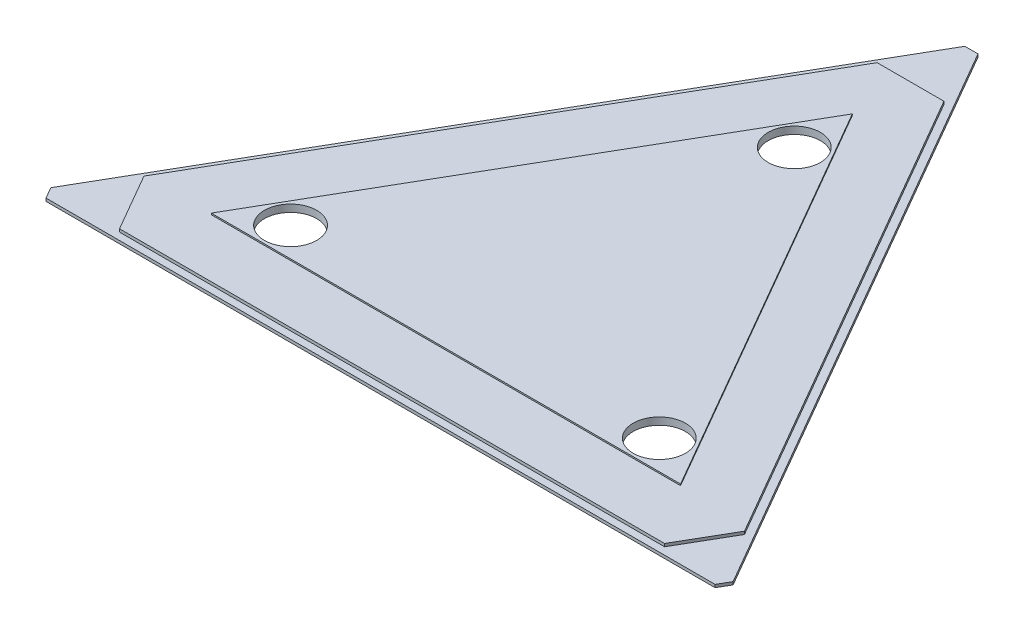
ISO-10303-21;
HEADER;
FILE_DESCRIPTION(('STEP AP214'),'2;1');
FILE_NAME('part.step','',(''),(''),'','','');
FILE_SCHEMA(('AUTOMOTIVE_DESIGN { 1 0 10303 214 1 1 1 1 }'));
ENDSEC;
DATA;
#1=APPLICATION_CONTEXT('core data for automotive mechanical design processes');
#2=APPLICATION_PROTOCOL_DEFINITION('international standard','automotive_design',2000,#1);
#3=PRODUCT_CONTEXT('',#1,'mechanical');
#4=PRODUCT('Part','Part','',(#3));
#5=PRODUCT_RELATED_PRODUCT_CATEGORY('part','',(#4));
#6=PRODUCT_DEFINITION_FORMATION('','',#4);
#7=PRODUCT_DEFINITION_CONTEXT('part definition',#1,'design');
#8=PRODUCT_DEFINITION('design','',#6,#7);
#9=PRODUCT_DEFINITION_SHAPE('','',#8);
#10=(LENGTH_UNIT() NAMED_UNIT(*) SI_UNIT(.MILLI.,.METRE.));
#11=(NAMED_UNIT(*) PLANE_ANGLE_UNIT() SI_UNIT($,.RADIAN.));
#12=(NAMED_UNIT(*) SI_UNIT($,.STERADIAN.) SOLID_ANGLE_UNIT());
#13=UNCERTAINTY_MEASURE_WITH_UNIT(LENGTH_MEASURE(1.E-05),#10,'distance_accuracy_value','');
#14=(GEOMETRIC_REPRESENTATION_CONTEXT(3) GLOBAL_UNCERTAINTY_ASSIGNED_CONTEXT((#13)) GLOBAL_UNIT_ASSIGNED_CONTEXT((#10,
#11,#12)) REPRESENTATION_CONTEXT('',''));
#15=CARTESIAN_POINT('',(0.,0.,0.));
#16=DIRECTION('',(0.,0.,1.));
#17=DIRECTION('',(1.,0.,0.));
#18=AXIS2_PLACEMENT_3D('',#15,#16,#17);
#19=CARTESIAN_POINT('',(407.03717678042,1.,235.006830179878));
#20=DIRECTION('',(0.866021896792226,0.,0.500006074239499));
#21=DIRECTION('',(0.500006074239499,0.,-0.866021896792226));
#22=AXIS2_PLACEMENT_3D('',#19,#20,#21);
#23=PLANE('',#22);
#24=DIRECTION('',(-0.500006074239499,0.,0.866021896792226));
#25=VECTOR('',#24,1.);
#26=CARTESIAN_POINT('',(407.03717678042,0.,235.006830179878));
#27=LINE('',#26,#25);
#28=CARTESIAN_POINT('',(464.784783451273,0.,134.98666154419));
#29=VERTEX_POINT('',#28);
#30=CARTESIAN_POINT('',(462.517056766971,0.,138.914415757042));
#31=VERTEX_POINT('',#30);
#32=EDGE_CURVE('E138',#29,#31,#27,.T.);
#33=ORIENTED_EDGE('',*,*,#32,.F.);
#34=DIRECTION('',(0.,-1.,0.));
#35=VECTOR('',#34,1.);
#36=CARTESIAN_POINT('',(464.784783451273,1.,134.98666154419));
#37=LINE('',#36,#35);
#38=CARTESIAN_POINT('',(464.784783451273,1.,134.98666154419));
#39=VERTEX_POINT('',#38);
#40=EDGE_CURVE('E11',#39,#29,#37,.T.);
#41=ORIENTED_EDGE('',*,*,#40,.F.);
#42=DIRECTION('',(-0.500006074239499,0.,0.866021896792226));
#43=VECTOR('',#42,1.);
#44=CARTESIAN_POINT('',(407.03717678042,1.,235.006830179878));
#45=LINE('',#44,#43);
#46=CARTESIAN_POINT('',(462.517056766971,1.,138.914415757042));
#47=VERTEX_POINT('',#46);
#48=EDGE_CURVE('E166',#39,#47,#45,.T.);
#49=ORIENTED_EDGE('',*,*,#48,.T.);
#50=DIRECTION('',(0.,-1.,0.));
#51=VECTOR('',#50,1.);
#52=CARTESIAN_POINT('',(462.517056766971,1.,138.914415757042));
#53=LINE('',#52,#51);
#54=EDGE_CURVE('E51',#47,#31,#53,.T.);
#55=ORIENTED_EDGE('',*,*,#54,.T.);
#56=EDGE_LOOP('',(#33,#41,#49,#55));
#57=FACE_BOUND('',#56,.T.);
#58=ADVANCED_FACE('F35',(#57),#23,.T.);
#59=CARTESIAN_POINT('',(290.137648553793,1.,-167.511049494579));
#60=DIRECTION('',(-0.866025403784438,0.,0.500000000000002));
#61=DIRECTION('',(0.500000000000002,0.,0.866025403784438));
#62=AXIS2_PLACEMENT_3D('',#59,#60,#61);
#63=PLANE('',#62);
#64=DIRECTION('',(-0.500000000000002,0.,-0.866025403784438));
#65=VECTOR('',#64,1.);
#66=CARTESIAN_POINT('',(290.137648553793,0.,-167.511049494579));
#67=LINE('',#66,#65);
#68=CARTESIAN_POINT('',(349.516789507603,0.,-64.6633604527868));
#69=VERTEX_POINT('',#68);
#70=EDGE_CURVE('E140',#29,#69,#67,.T.);
#71=ORIENTED_EDGE('',*,*,#70,.T.);
#72=DIRECTION('',(0.,-1.,0.));
#73=VECTOR('',#72,1.);
#74=CARTESIAN_POINT('',(349.516789507603,1.,-64.6633604527868));
#75=LINE('',#74,#73);
#76=CARTESIAN_POINT('',(349.516789507603,1.,-64.6633604527868));
#77=VERTEX_POINT('',#76);
#78=EDGE_CURVE('E43',#77,#69,#75,.T.);
#79=ORIENTED_EDGE('',*,*,#78,.F.);
#80=DIRECTION('',(-0.500000000000002,0.,-0.866025403784438));
#81=VECTOR('',#80,1.);
#82=CARTESIAN_POINT('',(290.137648553793,1.,-167.511049494579));
#83=LINE('',#82,#81);
#84=EDGE_CURVE('E167',#39,#77,#83,.T.);
#85=ORIENTED_EDGE('',*,*,#84,.F.);
#86=ORIENTED_EDGE('',*,*,#40,.T.);
#87=EDGE_LOOP('',(#71,#79,#85,#86));
#88=FACE_BOUND('',#87,.T.);
#89=ADVANCED_FACE('F162',(#88),#63,.F.);
#90=CARTESIAN_POINT('',(-1.97831855566332E-13,1.,-64.6633604527857));
#91=DIRECTION('',(0.,0.,1.));
#92=DIRECTION('',(1.,0.,0.));
#93=AXIS2_PLACEMENT_3D('',#90,#91,#92);
#94=PLANE('',#93);
#95=DIRECTION('',(-1.,0.,0.));
#96=VECTOR('',#95,1.);
#97=CARTESIAN_POINT('',(-1.97831855566332E-13,0.,-64.6633604527857));
#98=LINE('',#97,#96);
#99=CARTESIAN_POINT('',(344.980692968777,0.,-64.6633604527868));
#100=VERTEX_POINT('',#99);
#101=EDGE_CURVE('E144',#69,#100,#98,.T.);
#102=ORIENTED_EDGE('',*,*,#101,.T.);
#103=DIRECTION('',(0.,-1.,0.));
#104=VECTOR('',#103,1.);
#105=CARTESIAN_POINT('',(344.980692968777,1.,-64.6633604527868));
#106=LINE('',#105,#104);
#107=CARTESIAN_POINT('',(344.980692968777,1.,-64.6633604527868));
#108=VERTEX_POINT('',#107);
#109=EDGE_CURVE('E130',#108,#100,#106,.T.);
#110=ORIENTED_EDGE('',*,*,#109,.F.);
#111=DIRECTION('',(-1.,0.,0.));
#112=VECTOR('',#111,1.);
#113=CARTESIAN_POINT('',(-1.97831855566332E-13,1.,-64.6633604527857));
#114=LINE('',#113,#112);
#115=EDGE_CURVE('E119',#77,#108,#114,.T.);
#116=ORIENTED_EDGE('',*,*,#115,.F.);
#117=ORIENTED_EDGE('',*,*,#78,.T.);
#118=EDGE_LOOP('',(#102,#110,#116,#117));
#119=FACE_BOUND('',#118,.T.);
#120=ADVANCED_FACE('F158',(#119),#94,.F.);
#121=CARTESIAN_POINT('',(230.735228026722,1.,133.215264628187));
#122=DIRECTION('',(0.86602504848194,0.,0.500000615401474));
#123=DIRECTION('',(0.500000615401474,0.,-0.86602504848194));
#124=AXIS2_PLACEMENT_3D('',#121,#122,#123);
#125=PLANE('',#124);
#126=DIRECTION('',(-0.500000615401474,0.,0.86602504848194));
#127=VECTOR('',#126,1.);
#128=CARTESIAN_POINT('',(230.735228026722,0.,133.215264628187));
#129=LINE('',#128,#127);
#130=CARTESIAN_POINT('',(229.712705006684,0.,134.986323544367));
#131=VERTEX_POINT('',#130);
#132=EDGE_CURVE('E127',#100,#131,#129,.T.);
#133=ORIENTED_EDGE('',*,*,#132,.T.);
#134=DIRECTION('',(0.,-1.,0.));
#135=VECTOR('',#134,1.);
#136=CARTESIAN_POINT('',(229.712705006684,1.,134.986323544367));
#137=LINE('',#136,#135);
#138=CARTESIAN_POINT('',(229.712705006684,1.,134.986323544367));
#139=VERTEX_POINT('',#138);
#140=EDGE_CURVE('E125',#139,#131,#137,.T.);
#141=ORIENTED_EDGE('',*,*,#140,.F.);
#142=DIRECTION('',(-0.500000615401474,0.,0.86602504848194));
#143=VECTOR('',#142,1.);
#144=CARTESIAN_POINT('',(230.735228026722,1.,133.215264628187));
#145=LINE('',#144,#143);
#146=EDGE_CURVE('E111',#108,#139,#145,.T.);
#147=ORIENTED_EDGE('',*,*,#146,.F.);
#148=ORIENTED_EDGE('',*,*,#109,.T.);
#149=EDGE_LOOP('',(#133,#141,#147,#148));
#150=FACE_BOUND('',#149,.T.);
#151=ADVANCED_FACE('F126',(#150),#125,.F.);
#152=CARTESIAN_POINT('',(113.804176772823,1.,-65.7217079781947));
#153=DIRECTION('',(-0.865969925518022,0.,0.500096078867163));
#154=DIRECTION('',(0.500096078867163,0.,0.865969925518022));
#155=AXIS2_PLACEMENT_3D('',#152,#153,#154);
#156=PLANE('',#155);
#157=DIRECTION('',(-0.500096078867163,0.,-0.865969925518022));
#158=VECTOR('',#157,1.);
#159=CARTESIAN_POINT('',(113.804176772823,0.,-65.7217079781947));
#160=LINE('',#159,#158);
#161=CARTESIAN_POINT('',(231.98117121446,0.,138.914415757042));
#162=VERTEX_POINT('',#161);
#163=EDGE_CURVE('E148',#162,#131,#160,.T.);
#164=ORIENTED_EDGE('',*,*,#163,.F.);
#165=DIRECTION('',(0.,-1.,0.));
#166=VECTOR('',#165,1.);
#167=CARTESIAN_POINT('',(231.98117121446,1.,138.914415757042));
#168=LINE('',#167,#166);
#169=CARTESIAN_POINT('',(231.98117121446,1.,138.914415757042));
#170=VERTEX_POINT('',#169);
#171=EDGE_CURVE('E71',#170,#162,#168,.T.);
#172=ORIENTED_EDGE('',*,*,#171,.F.);
#173=DIRECTION('',(-0.500096078867163,0.,-0.865969925518022));
#174=VECTOR('',#173,1.);
#175=CARTESIAN_POINT('',(113.804176772823,1.,-65.7217079781947));
#176=LINE('',#175,#174);
#177=EDGE_CURVE('E117',#170,#139,#176,.T.);
#178=ORIENTED_EDGE('',*,*,#177,.T.);
#179=ORIENTED_EDGE('',*,*,#140,.T.);
#180=EDGE_LOOP('',(#164,#172,#178,#179));
#181=FACE_BOUND('',#180,.T.);
#182=ADVANCED_FACE('F132',(#181),#156,.T.);
#183=CARTESIAN_POINT('',(0.,1.,138.914415757042));
#184=DIRECTION('',(0.,0.,1.));
#185=DIRECTION('',(1.,0.,0.));
#186=AXIS2_PLACEMENT_3D('',#183,#184,#185);
#187=PLANE('',#186);
#188=DIRECTION('',(-1.,0.,0.));
#189=VECTOR('',#188,1.);
#190=CARTESIAN_POINT('',(0.,0.,138.914415757042));
#191=LINE('',#190,#189);
#192=EDGE_CURVE('E150',#31,#162,#191,.T.);
#193=ORIENTED_EDGE('',*,*,#192,.F.);
#194=ORIENTED_EDGE('',*,*,#54,.F.);
#195=DIRECTION('',(-1.,0.,0.));
#196=VECTOR('',#195,1.);
#197=CARTESIAN_POINT('',(0.,1.,138.914415757042));
#198=LINE('',#197,#196);
#199=EDGE_CURVE('E133',#47,#170,#198,.T.);
#200=ORIENTED_EDGE('',*,*,#199,.T.);
#201=ORIENTED_EDGE('',*,*,#171,.T.);
#202=EDGE_LOOP('',(#193,#194,#200,#201));
#203=FACE_BOUND('',#202,.T.);
#204=ADVANCED_FACE('F361',(#203),#187,.T.);
#205=CARTESIAN_POINT('',(0.,1.,0.));
#206=DIRECTION('',(0.,1.,0.));
#207=DIRECTION('',(0.,0.,1.));
#208=AXIS2_PLACEMENT_3D('',#205,#206,#207);
#209=PLANE('',#208);
#210=DIRECTION('',(-0.501404010499261,0.,0.865213279056244));
#211=VECTOR('',#210,1.);
#212=CARTESIAN_POINT('',(390.506554541865,1.,226.30437756008));
#213=LINE('',#212,#211);
#214=CARTESIAN_POINT('',(452.699916625105,1.,118.984688014734));
#215=VERTEX_POINT('',#214);
#216=CARTESIAN_POINT('',(442.602090749265,1.,136.40930539798));
#217=VERTEX_POINT('',#216);
#218=EDGE_CURVE('E84',#215,#217,#213,.T.);
#219=ORIENTED_EDGE('',*,*,#218,.T.);
#220=DIRECTION('',(-0.999999999997625,0.,-2.17931289567932E-06));
#221=VECTOR('',#220,1.);
#222=CARTESIAN_POINT('',(-0.000297276456247321,1.,136.408340828888));
#223=LINE('',#222,#221);
#224=CARTESIAN_POINT('',(254.809280576088,1.,136.408896138687));
#225=VERTEX_POINT('',#224);
#226=EDGE_CURVE('E183',#217,#225,#223,.T.);
#227=ORIENTED_EDGE('',*,*,#226,.T.);
#228=DIRECTION('',(0.500061082747631,0.,0.86599013477133));
#229=VECTOR('',#228,1.);
#230=CARTESIAN_POINT('',(132.019800225658,1.,-76.2340835007328));
#231=LINE('',#230,#229);
#232=CARTESIAN_POINT('',(243.304219773312,1.,116.484791866457));
#233=VERTEX_POINT('',#232);
#234=EDGE_CURVE('E180',#233,#225,#231,.T.);
#235=ORIENTED_EDGE('',*,*,#234,.F.);
#236=DIRECTION('',(-0.500000615401474,0.,0.866025048481941));
#237=VECTOR('',#236,1.);
#238=CARTESIAN_POINT('',(232.917450942825,1.,134.475173683829));
#239=LINE('',#238,#237);
#240=CARTESIAN_POINT('',(335.767496284372,1.,-43.6660380660085));
#241=VERTEX_POINT('',#240);
#242=EDGE_CURVE('E177',#241,#233,#239,.T.);
#243=ORIENTED_EDGE('',*,*,#242,.F.);
#244=DIRECTION('',(-1.,0.,0.));
#245=VECTOR('',#244,1.);
#246=CARTESIAN_POINT('',(0.,1.,-43.6660380660085));
#247=LINE('',#246,#245);
#248=CARTESIAN_POINT('',(358.778179034986,1.,-43.6660380660085));
#249=VERTEX_POINT('',#248);
#250=EDGE_CURVE('E172',#249,#241,#247,.T.);
#251=ORIENTED_EDGE('',*,*,#250,.F.);
#252=DIRECTION('',(-0.500061082747631,0.,-0.86599013477133));
#253=VECTOR('',#252,1.);
#254=CARTESIAN_POINT('',(287.97120668039,1.,-166.287337038502));
#255=LINE('',#254,#253);
#256=EDGE_CURVE('E169',#215,#249,#255,.T.);
#257=ORIENTED_EDGE('',*,*,#256,.F.);
#258=EDGE_LOOP('',(#219,#227,#235,#243,#251,#257));
#259=FACE_BOUND('',#258,.T.);
#260=ORIENTED_EDGE('',*,*,#48,.F.);
#261=ORIENTED_EDGE('',*,*,#84,.T.);
#262=ORIENTED_EDGE('',*,*,#115,.T.);
#263=ORIENTED_EDGE('',*,*,#146,.T.);
#264=ORIENTED_EDGE('',*,*,#177,.F.);
#265=ORIENTED_EDGE('',*,*,#199,.F.);
#266=EDGE_LOOP('',(#260,#261,#262,#263,#264,#265));
#267=FACE_BOUND('',#266,.T.);
#268=ADVANCED_FACE('F114',(#259,#267),#209,.T.);
#269=CARTESIAN_POINT('',(0.,0.,0.));
#270=DIRECTION('',(0.,1.,0.));
#271=DIRECTION('',(0.,0.,1.));
#272=AXIS2_PLACEMENT_3D('',#269,#270,#271);
#273=PLANE('',#272);
#274=ORIENTED_EDGE('',*,*,#32,.T.);
#275=ORIENTED_EDGE('',*,*,#192,.T.);
#276=ORIENTED_EDGE('',*,*,#163,.T.);
#277=ORIENTED_EDGE('',*,*,#132,.F.);
#278=ORIENTED_EDGE('',*,*,#101,.F.);
#279=ORIENTED_EDGE('',*,*,#70,.F.);
#280=EDGE_LOOP('',(#274,#275,#276,#277,#278,#279));
#281=FACE_BOUND('',#280,.T.);
#282=CARTESIAN_POINT('',(283.758521159064,0.,106.426112565137));
#283=DIRECTION('',(0.,1.,0.));
#284=DIRECTION('',(0.,0.,1.));
#285=AXIS2_PLACEMENT_3D('',#282,#283,#284);
#286=CIRCLE('',#285,8.99999999999999);
#287=CARTESIAN_POINT('',(283.758521159064,0.,115.426112565137));
#288=VERTEX_POINT('',#287);
#289=EDGE_CURVE('E247',#288,#288,#286,.T.);
#290=ORIENTED_EDGE('',*,*,#289,.T.);
#291=EDGE_LOOP('',(#290));
#292=FACE_BOUND('',#291,.T.);
#293=CARTESIAN_POINT('',(410.793152562545,0.,106.417182486529));
#294=DIRECTION('',(0.,1.,0.));
#295=DIRECTION('',(0.,0.,1.));
#296=AXIS2_PLACEMENT_3D('',#293,#294,#295);
#297=CIRCLE('',#296,8.99999999999999);
#298=CARTESIAN_POINT('',(410.793152562545,0.,115.417182486529));
#299=VERTEX_POINT('',#298);
#300=EDGE_CURVE('E244',#299,#299,#297,.T.);
#301=ORIENTED_EDGE('',*,*,#300,.T.);
#302=EDGE_LOOP('',(#301));
#303=FACE_BOUND('',#302,.T.);
#304=CARTESIAN_POINT('',(347.27360972876,0.,-3.60923082455256));
#305=DIRECTION('',(0.,1.,0.));
#306=DIRECTION('',(0.,0.,1.));
#307=AXIS2_PLACEMENT_3D('',#304,#305,#306);
#308=CIRCLE('',#307,8.99999999999998);
#309=CARTESIAN_POINT('',(347.27360972876,0.,5.39076917544742));
#310=VERTEX_POINT('',#309);
#311=EDGE_CURVE('E240',#310,#310,#308,.T.);
#312=ORIENTED_EDGE('',*,*,#311,.T.);
#313=EDGE_LOOP('',(#312));
#314=FACE_BOUND('',#313,.T.);
#315=ADVANCED_FACE('F164',(#281,#292,#303,#314),#273,.F.);
#316=CARTESIAN_POINT('',(-0.000297276456247321,2.,136.408340828888));
#317=DIRECTION('',(-2.17931289567932E-06,0.,0.999999999997625));
#318=DIRECTION('',(0.999999999997625,0.,2.17931289567932E-06));
#319=AXIS2_PLACEMENT_3D('',#316,#317,#318);
#320=PLANE('',#319);
#321=DIRECTION('',(0.,-1.,0.));
#322=VECTOR('',#321,1.);
#323=CARTESIAN_POINT('',(254.809280576088,2.,136.408896138687));
#324=LINE('',#323,#322);
#325=CARTESIAN_POINT('',(254.809280576088,2.,136.408896138687));
#326=VERTEX_POINT('',#325);
#327=EDGE_CURVE('E200',#326,#225,#324,.T.);
#328=ORIENTED_EDGE('',*,*,#327,.T.);
#329=ORIENTED_EDGE('',*,*,#226,.F.);
#330=DIRECTION('',(0.,-1.,0.));
#331=VECTOR('',#330,1.);
#332=CARTESIAN_POINT('',(442.602090749265,2.,136.40930539798));
#333=LINE('',#332,#331);
#334=CARTESIAN_POINT('',(442.602090749265,2.,136.40930539798));
#335=VERTEX_POINT('',#334);
#336=EDGE_CURVE('E141',#335,#217,#333,.T.);
#337=ORIENTED_EDGE('',*,*,#336,.F.);
#338=DIRECTION('',(-0.999999999997625,0.,-2.17931289567932E-06));
#339=VECTOR('',#338,1.);
#340=CARTESIAN_POINT('',(-0.000297276456247321,2.,136.408340828888));
#341=LINE('',#340,#339);
#342=EDGE_CURVE('E227',#335,#326,#341,.T.);
#343=ORIENTED_EDGE('',*,*,#342,.T.);
#344=EDGE_LOOP('',(#328,#329,#337,#343));
#345=FACE_BOUND('',#344,.T.);
#346=ADVANCED_FACE('F321',(#345),#320,.T.);
#347=CARTESIAN_POINT('',(390.506554541865,2.,226.30437756008));
#348=DIRECTION('',(0.865213279056244,0.,0.501404010499261));
#349=DIRECTION('',(0.501404010499261,0.,-0.865213279056244));
#350=AXIS2_PLACEMENT_3D('',#347,#348,#349);
#351=PLANE('',#350);
#352=ORIENTED_EDGE('',*,*,#336,.T.);
#353=ORIENTED_EDGE('',*,*,#218,.F.);
#354=DIRECTION('',(0.,-1.,0.));
#355=VECTOR('',#354,1.);
#356=CARTESIAN_POINT('',(452.699916625105,2.,118.984688014734));
#357=LINE('',#356,#355);
#358=CARTESIAN_POINT('',(452.699916625105,2.,118.984688014734));
#359=VERTEX_POINT('',#358);
#360=EDGE_CURVE('E188',#359,#215,#357,.T.);
#361=ORIENTED_EDGE('',*,*,#360,.F.);
#362=DIRECTION('',(-0.501404010499261,0.,0.865213279056244));
#363=VECTOR('',#362,1.);
#364=CARTESIAN_POINT('',(390.506554541865,2.,226.30437756008));
#365=LINE('',#364,#363);
#366=EDGE_CURVE('E224',#359,#335,#365,.T.);
#367=ORIENTED_EDGE('',*,*,#366,.T.);
#368=EDGE_LOOP('',(#352,#353,#361,#367));
#369=FACE_BOUND('',#368,.T.);
#370=ADVANCED_FACE('F328',(#369),#351,.T.);
#371=CARTESIAN_POINT('',(287.97120668039,2.,-166.287337038502));
#372=DIRECTION('',(-0.86599013477133,0.,0.500061082747631));
#373=DIRECTION('',(0.500061082747631,0.,0.86599013477133));
#374=AXIS2_PLACEMENT_3D('',#371,#372,#373);
#375=PLANE('',#374);
#376=ORIENTED_EDGE('',*,*,#256,.T.);
#377=DIRECTION('',(0.,-1.,0.));
#378=VECTOR('',#377,1.);
#379=CARTESIAN_POINT('',(358.778179034986,2.,-43.6660380660085));
#380=LINE('',#379,#378);
#381=CARTESIAN_POINT('',(358.778179034986,2.,-43.6660380660085));
#382=VERTEX_POINT('',#381);
#383=EDGE_CURVE('E191',#382,#249,#380,.T.);
#384=ORIENTED_EDGE('',*,*,#383,.F.);
#385=DIRECTION('',(-0.500061082747631,0.,-0.86599013477133));
#386=VECTOR('',#385,1.);
#387=CARTESIAN_POINT('',(287.97120668039,2.,-166.287337038502));
#388=LINE('',#387,#386);
#389=EDGE_CURVE('E221',#359,#382,#388,.T.);
#390=ORIENTED_EDGE('',*,*,#389,.F.);
#391=ORIENTED_EDGE('',*,*,#360,.T.);
#392=EDGE_LOOP('',(#376,#384,#390,#391));
#393=FACE_BOUND('',#392,.T.);
#394=ADVANCED_FACE('F332',(#393),#375,.F.);
#395=CARTESIAN_POINT('',(0.,2.,-43.6660380660085));
#396=DIRECTION('',(0.,0.,1.));
#397=DIRECTION('',(1.,0.,0.));
#398=AXIS2_PLACEMENT_3D('',#395,#396,#397);
#399=PLANE('',#398);
#400=ORIENTED_EDGE('',*,*,#250,.T.);
#401=DIRECTION('',(0.,-1.,0.));
#402=VECTOR('',#401,1.);
#403=CARTESIAN_POINT('',(335.767496284372,2.,-43.6660380660085));
#404=LINE('',#403,#402);
#405=CARTESIAN_POINT('',(335.767496284372,2.,-43.6660380660085));
#406=VERTEX_POINT('',#405);
#407=EDGE_CURVE('E194',#406,#241,#404,.T.);
#408=ORIENTED_EDGE('',*,*,#407,.F.);
#409=DIRECTION('',(-1.,0.,0.));
#410=VECTOR('',#409,1.);
#411=CARTESIAN_POINT('',(0.,2.,-43.6660380660085));
#412=LINE('',#411,#410);
#413=EDGE_CURVE('E218',#382,#406,#412,.T.);
#414=ORIENTED_EDGE('',*,*,#413,.F.);
#415=ORIENTED_EDGE('',*,*,#383,.T.);
#416=EDGE_LOOP('',(#400,#408,#414,#415));
#417=FACE_BOUND('',#416,.T.);
#418=ADVANCED_FACE('F337',(#417),#399,.F.);
#419=CARTESIAN_POINT('',(232.917450942825,2.,134.475173683829));
#420=DIRECTION('',(0.866025048481941,0.,0.500000615401474));
#421=DIRECTION('',(0.500000615401474,0.,-0.866025048481941));
#422=AXIS2_PLACEMENT_3D('',#419,#420,#421);
#423=PLANE('',#422);
#424=ORIENTED_EDGE('',*,*,#242,.T.);
#425=DIRECTION('',(0.,-1.,0.));
#426=VECTOR('',#425,1.);
#427=CARTESIAN_POINT('',(243.304219773312,2.,116.484791866457));
#428=LINE('',#427,#426);
#429=CARTESIAN_POINT('',(243.304219773312,2.,116.484791866457));
#430=VERTEX_POINT('',#429);
#431=EDGE_CURVE('E197',#430,#233,#428,.T.);
#432=ORIENTED_EDGE('',*,*,#431,.F.);
#433=DIRECTION('',(-0.500000615401474,0.,0.866025048481941));
#434=VECTOR('',#433,1.);
#435=CARTESIAN_POINT('',(232.917450942825,2.,134.475173683829));
#436=LINE('',#435,#434);
#437=EDGE_CURVE('E215',#406,#430,#436,.T.);
#438=ORIENTED_EDGE('',*,*,#437,.F.);
#439=ORIENTED_EDGE('',*,*,#407,.T.);
#440=EDGE_LOOP('',(#424,#432,#438,#439));
#441=FACE_BOUND('',#440,.T.);
#442=ADVANCED_FACE('F339',(#441),#423,.F.);
#443=CARTESIAN_POINT('',(132.019800225658,2.,-76.2340835007328));
#444=DIRECTION('',(0.86599013477133,0.,-0.500061082747631));
#445=DIRECTION('',(-0.500061082747631,0.,-0.86599013477133));
#446=AXIS2_PLACEMENT_3D('',#443,#444,#445);
#447=PLANE('',#446);
#448=ORIENTED_EDGE('',*,*,#234,.T.);
#449=ORIENTED_EDGE('',*,*,#327,.F.);
#450=DIRECTION('',(0.500061082747631,0.,0.86599013477133));
#451=VECTOR('',#450,1.);
#452=CARTESIAN_POINT('',(132.019800225658,2.,-76.2340835007328));
#453=LINE('',#452,#451);
#454=EDGE_CURVE('E212',#430,#326,#453,.T.);
#455=ORIENTED_EDGE('',*,*,#454,.F.);
#456=ORIENTED_EDGE('',*,*,#431,.T.);
#457=EDGE_LOOP('',(#448,#449,#455,#456));
#458=FACE_BOUND('',#457,.T.);
#459=ADVANCED_FACE('F318',(#458),#447,.F.);
#460=CARTESIAN_POINT('',(0.,2.,0.));
#461=DIRECTION('',(0.,1.,0.));
#462=DIRECTION('',(0.,0.,1.));
#463=AXIS2_PLACEMENT_3D('',#460,#461,#462);
#464=PLANE('',#463);
#465=ORIENTED_EDGE('',*,*,#342,.F.);
#466=ORIENTED_EDGE('',*,*,#366,.F.);
#467=ORIENTED_EDGE('',*,*,#389,.T.);
#468=ORIENTED_EDGE('',*,*,#413,.T.);
#469=ORIENTED_EDGE('',*,*,#437,.T.);
#470=ORIENTED_EDGE('',*,*,#454,.T.);
#471=EDGE_LOOP('',(#465,#466,#467,#468,#469,#470));
#472=FACE_BOUND('',#471,.T.);
#473=DIRECTION('',(0.999999997750373,0.,-6.70764780179426E-05));
#474=VECTOR('',#473,1.);
#475=CARTESIAN_POINT('',(0.00781077956215997,2.,116.445880514169));
#476=LINE('',#475,#474);
#477=CARTESIAN_POINT('',(266.439108268201,2.,116.42800924106));
#478=VERTEX_POINT('',#477);
#479=CARTESIAN_POINT('',(428.113670918371,2.,116.417164680787));
#480=VERTEX_POINT('',#479);
#481=EDGE_CURVE('E209',#478,#480,#476,.T.);
#482=ORIENTED_EDGE('',*,*,#481,.F.);
#483=DIRECTION('',(0.499925612829375,0.,-0.866068346977982));
#484=VECTOR('',#483,1.);
#485=CARTESIAN_POINT('',(250.258955329302,2.,144.458416065656));
#486=LINE('',#485,#484);
#487=CARTESIAN_POINT('',(347.27360972876,2.,-23.6092308245526));
#488=VERTEX_POINT('',#487);
#489=EDGE_CURVE('E206',#478,#488,#486,.T.);
#490=ORIENTED_EDGE('',*,*,#489,.T.);
#491=DIRECTION('',(0.499980443738663,0.,0.866036694302782));
#492=VECTOR('',#491,1.);
#493=CARTESIAN_POINT('',(270.684828790068,2.,-156.271808922297));
#494=LINE('',#493,#492);
#495=EDGE_CURVE('E203',#488,#480,#494,.T.);
#496=ORIENTED_EDGE('',*,*,#495,.T.);
#497=EDGE_LOOP('',(#482,#490,#496));
#498=FACE_BOUND('',#497,.T.);
#499=ADVANCED_FACE('F325',(#472,#498),#464,.T.);
#500=CARTESIAN_POINT('',(250.258955329302,2.5,144.458416065656));
#501=DIRECTION('',(-0.866068346977982,0.,-0.499925612829375));
#502=DIRECTION('',(-0.499925612829375,0.,0.866068346977982));
#503=AXIS2_PLACEMENT_3D('',#500,#501,#502);
#504=PLANE('',#503);
#505=DIRECTION('',(0.,-1.,0.));
#506=VECTOR('',#505,1.);
#507=CARTESIAN_POINT('',(347.27360972876,2.5,-23.6092308245526));
#508=LINE('',#507,#506);
#509=CARTESIAN_POINT('',(347.27360972876,2.5,-23.6092308245526));
#510=VERTEX_POINT('',#509);
#511=EDGE_CURVE('E236',#510,#488,#508,.T.);
#512=ORIENTED_EDGE('',*,*,#511,.T.);
#513=ORIENTED_EDGE('',*,*,#489,.F.);
#514=DIRECTION('',(0.,-1.,0.));
#515=VECTOR('',#514,1.);
#516=CARTESIAN_POINT('',(266.439108268201,2.5,116.42800924106));
#517=LINE('',#516,#515);
#518=CARTESIAN_POINT('',(266.439108268201,2.5,116.42800924106));
#519=VERTEX_POINT('',#518);
#520=EDGE_CURVE('E230',#519,#478,#517,.T.);
#521=ORIENTED_EDGE('',*,*,#520,.F.);
#522=DIRECTION('',(0.499925612829375,0.,-0.866068346977982));
#523=VECTOR('',#522,1.);
#524=CARTESIAN_POINT('',(250.258955329302,2.5,144.458416065656));
#525=LINE('',#524,#523);
#526=EDGE_CURVE('E255',#519,#510,#525,.T.);
#527=ORIENTED_EDGE('',*,*,#526,.T.);
#528=EDGE_LOOP('',(#512,#513,#521,#527));
#529=FACE_BOUND('',#528,.T.);
#530=ADVANCED_FACE('F289',(#529),#504,.T.);
#531=CARTESIAN_POINT('',(0.00781077956215997,2.5,116.445880514169));
#532=DIRECTION('',(-6.70764780179426E-05,0.,-0.999999997750373));
#533=DIRECTION('',(-0.999999997750373,0.,6.70764780179426E-05));
#534=AXIS2_PLACEMENT_3D('',#531,#532,#533);
#535=PLANE('',#534);
#536=ORIENTED_EDGE('',*,*,#481,.T.);
#537=DIRECTION('',(0.,-1.,0.));
#538=VECTOR('',#537,1.);
#539=CARTESIAN_POINT('',(428.113670918371,2.5,116.417164680787));
#540=LINE('',#539,#538);
#541=CARTESIAN_POINT('',(428.113670918371,2.5,116.417164680787));
#542=VERTEX_POINT('',#541);
#543=EDGE_CURVE('E233',#542,#480,#540,.T.);
#544=ORIENTED_EDGE('',*,*,#543,.F.);
#545=DIRECTION('',(0.999999997750373,0.,-6.70764780179426E-05));
#546=VECTOR('',#545,1.);
#547=CARTESIAN_POINT('',(0.00781077956215997,2.5,116.445880514169));
#548=LINE('',#547,#546);
#549=EDGE_CURVE('E252',#519,#542,#548,.T.);
#550=ORIENTED_EDGE('',*,*,#549,.F.);
#551=ORIENTED_EDGE('',*,*,#520,.T.);
#552=EDGE_LOOP('',(#536,#544,#550,#551));
#553=FACE_BOUND('',#552,.T.);
#554=ADVANCED_FACE('F415',(#553),#535,.F.);
#555=CARTESIAN_POINT('',(347.27360972876,2.5,-3.60923082455256));
#556=DIRECTION('',(0.,-1.,0.));
#557=DIRECTION('',(0.,0.,-1.));
#558=AXIS2_PLACEMENT_3D('',#555,#556,#557);
#559=CYLINDRICAL_SURFACE('',#558,8.99999999999998);
#560=CARTESIAN_POINT('',(347.27360972876,2.5,-3.60923082455256));
#561=DIRECTION('',(0.,1.,0.));
#562=DIRECTION('',(0.,0.,1.));
#563=AXIS2_PLACEMENT_3D('',#560,#561,#562);
#564=CIRCLE('',#563,8.99999999999998);
#565=CARTESIAN_POINT('',(347.27360972876,2.5,5.39076917544742));
#566=VERTEX_POINT('',#565);
#567=EDGE_CURVE('E258',#566,#566,#564,.T.);
#568=ORIENTED_EDGE('',*,*,#567,.T.);
#569=EDGE_LOOP('',(#568));
#570=FACE_BOUND('',#569,.T.);
#571=ORIENTED_EDGE('',*,*,#311,.F.);
#572=EDGE_LOOP('',(#571));
#573=FACE_BOUND('',#572,.T.);
#574=ADVANCED_FACE('F424',(#570,#573),#559,.F.);
#575=CARTESIAN_POINT('',(410.793152562545,2.5,106.417182486529));
#576=DIRECTION('',(0.,-1.,0.));
#577=DIRECTION('',(0.,0.,-1.));
#578=AXIS2_PLACEMENT_3D('',#575,#576,#577);
#579=CYLINDRICAL_SURFACE('',#578,8.99999999999999);
#580=CARTESIAN_POINT('',(410.793152562545,2.5,106.417182486529));
#581=DIRECTION('',(0.,1.,0.));
#582=DIRECTION('',(0.,0.,1.));
#583=AXIS2_PLACEMENT_3D('',#580,#581,#582);
#584=CIRCLE('',#583,8.99999999999999);
#585=CARTESIAN_POINT('',(410.793152562545,2.5,115.417182486529));
#586=VERTEX_POINT('',#585);
#587=EDGE_CURVE('E261',#586,#586,#584,.T.);
#588=ORIENTED_EDGE('',*,*,#587,.T.);
#589=EDGE_LOOP('',(#588));
#590=FACE_BOUND('',#589,.T.);
#591=ORIENTED_EDGE('',*,*,#300,.F.);
#592=EDGE_LOOP('',(#591));
#593=FACE_BOUND('',#592,.T.);
#594=ADVANCED_FACE('F434',(#590,#593),#579,.F.);
#595=CARTESIAN_POINT('',(283.758521159064,2.5,106.426112565137));
#596=DIRECTION('',(0.,-1.,0.));
#597=DIRECTION('',(0.,0.,-1.));
#598=AXIS2_PLACEMENT_3D('',#595,#596,#597);
#599=CYLINDRICAL_SURFACE('',#598,8.99999999999999);
#600=CARTESIAN_POINT('',(283.758521159064,2.5,106.426112565137));
#601=DIRECTION('',(0.,1.,0.));
#602=DIRECTION('',(0.,0.,1.));
#603=AXIS2_PLACEMENT_3D('',#600,#601,#602);
#604=CIRCLE('',#603,8.99999999999999);
#605=CARTESIAN_POINT('',(283.758521159064,2.5,115.426112565137));
#606=VERTEX_POINT('',#605);
#607=EDGE_CURVE('E243',#606,#606,#604,.T.);
#608=ORIENTED_EDGE('',*,*,#607,.T.);
#609=EDGE_LOOP('',(#608));
#610=FACE_BOUND('',#609,.T.);
#611=ORIENTED_EDGE('',*,*,#289,.F.);
#612=EDGE_LOOP('',(#611));
#613=FACE_BOUND('',#612,.T.);
#614=ADVANCED_FACE('F267',(#610,#613),#599,.F.);
#615=CARTESIAN_POINT('',(270.684828790068,2.5,-156.271808922297));
#616=DIRECTION('',(0.866036694302782,0.,-0.499980443738663));
#617=DIRECTION('',(-0.499980443738663,0.,-0.866036694302782));
#618=AXIS2_PLACEMENT_3D('',#615,#616,#617);
#619=PLANE('',#618);
#620=ORIENTED_EDGE('',*,*,#543,.T.);
#621=ORIENTED_EDGE('',*,*,#495,.F.);
#622=ORIENTED_EDGE('',*,*,#511,.F.);
#623=DIRECTION('',(0.499980443738663,0.,0.866036694302782));
#624=VECTOR('',#623,1.);
#625=CARTESIAN_POINT('',(270.684828790068,2.5,-156.271808922297));
#626=LINE('',#625,#624);
#627=EDGE_CURVE('E239',#510,#542,#626,.T.);
#628=ORIENTED_EDGE('',*,*,#627,.T.);
#629=EDGE_LOOP('',(#620,#621,#622,#628));
#630=FACE_BOUND('',#629,.T.);
#631=ADVANCED_FACE('F273',(#630),#619,.T.);
#632=CARTESIAN_POINT('',(0.,2.5,0.));
#633=DIRECTION('',(0.,1.,0.));
#634=DIRECTION('',(0.,0.,1.));
#635=AXIS2_PLACEMENT_3D('',#632,#633,#634);
#636=PLANE('',#635);
#637=ORIENTED_EDGE('',*,*,#607,.F.);
#638=EDGE_LOOP('',(#637));
#639=FACE_BOUND('',#638,.T.);
#640=ORIENTED_EDGE('',*,*,#587,.F.);
#641=EDGE_LOOP('',(#640));
#642=FACE_BOUND('',#641,.T.);
#643=ORIENTED_EDGE('',*,*,#567,.F.);
#644=EDGE_LOOP('',(#643));
#645=FACE_BOUND('',#644,.T.);
#646=ORIENTED_EDGE('',*,*,#526,.F.);
#647=ORIENTED_EDGE('',*,*,#549,.T.);
#648=ORIENTED_EDGE('',*,*,#627,.F.);
#649=EDGE_LOOP('',(#646,#647,#648));
#650=FACE_BOUND('',#649,.T.);
#651=ADVANCED_FACE('F270',(#639,#642,#645,#650),#636,.T.);
#652=CLOSED_SHELL('',(#58,#89,#120,#151,#182,#204,#268,#315,#346,#370,#394,#418,#442,#459,#499,
#530,#554,#574,#594,#614,#631,#651));
#653=MANIFOLD_SOLID_BREP('B2',#652);
#654=ADVANCED_BREP_SHAPE_REPRESENTATION('',(#18,#653),#14);
#655=SHAPE_DEFINITION_REPRESENTATION(#9,#654);
ENDSEC;
END-ISO-10303-21;
